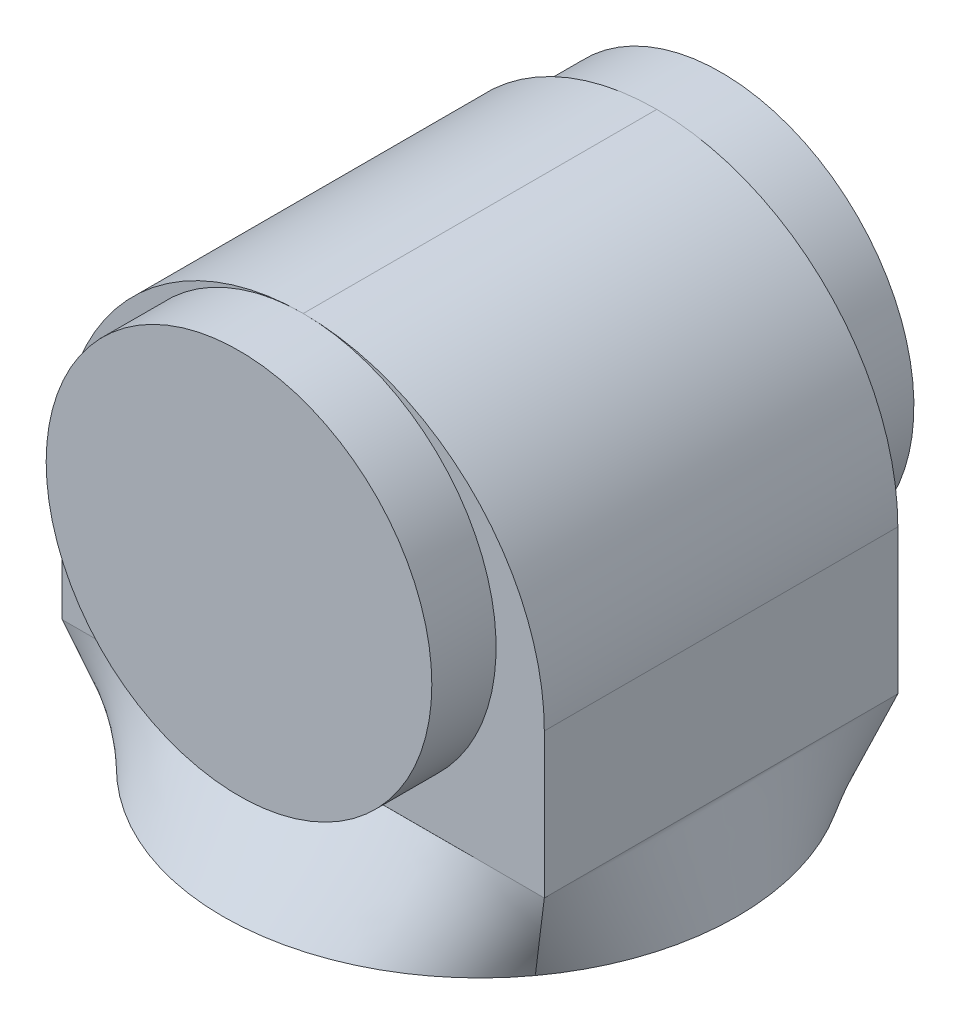
ISO-10303-21;
HEADER;
FILE_DESCRIPTION(('STEP AP214'),'2;1');
FILE_NAME('part.step','',(''),(''),'','','');
FILE_SCHEMA(('AUTOMOTIVE_DESIGN { 1 0 10303 214 1 1 1 1 }'));
ENDSEC;
DATA;
#1=APPLICATION_CONTEXT('core data for automotive mechanical design processes');
#2=APPLICATION_PROTOCOL_DEFINITION('international standard','automotive_design',2000,#1);
#3=PRODUCT_CONTEXT('',#1,'mechanical');
#4=PRODUCT('Part','Part','',(#3));
#5=PRODUCT_RELATED_PRODUCT_CATEGORY('part','',(#4));
#6=PRODUCT_DEFINITION_FORMATION('','',#4);
#7=PRODUCT_DEFINITION_CONTEXT('part definition',#1,'design');
#8=PRODUCT_DEFINITION('design','',#6,#7);
#9=PRODUCT_DEFINITION_SHAPE('','',#8);
#10=(LENGTH_UNIT() NAMED_UNIT(*) SI_UNIT(.MILLI.,.METRE.));
#11=(NAMED_UNIT(*) PLANE_ANGLE_UNIT() SI_UNIT($,.RADIAN.));
#12=(NAMED_UNIT(*) SI_UNIT($,.STERADIAN.) SOLID_ANGLE_UNIT());
#13=UNCERTAINTY_MEASURE_WITH_UNIT(LENGTH_MEASURE(1.E-05),#10,'distance_accuracy_value','');
#14=(GEOMETRIC_REPRESENTATION_CONTEXT(3) GLOBAL_UNCERTAINTY_ASSIGNED_CONTEXT((#13)) GLOBAL_UNIT_ASSIGNED_CONTEXT((#10,
#11,#12)) REPRESENTATION_CONTEXT('',''));
#15=CARTESIAN_POINT('',(0.,0.,0.));
#16=DIRECTION('',(0.,0.,1.));
#17=DIRECTION('',(1.,0.,0.));
#18=AXIS2_PLACEMENT_3D('',#15,#16,#17);
#19=CARTESIAN_POINT('',(75.,150.,-55.));
#20=DIRECTION('',(0.,0.,1.));
#21=DIRECTION('',(1.,0.,0.));
#22=AXIS2_PLACEMENT_3D('',#19,#20,#21);
#23=PLANE('',#22);
#24=DIRECTION('',(0.,-1.,0.));
#25=VECTOR('',#24,1.);
#26=CARTESIAN_POINT('',(-75.,150.,-55.));
#27=LINE('',#26,#25);
#28=CARTESIAN_POINT('',(-75.,75.,-55.));
#29=VERTEX_POINT('',#28);
#30=CARTESIAN_POINT('',(-75.,30.,-55.));
#31=VERTEX_POINT('',#30);
#32=EDGE_CURVE('E315',#29,#31,#27,.T.);
#33=ORIENTED_EDGE('',*,*,#32,.F.);
#34=CARTESIAN_POINT('',(0.,75.,-55.));
#35=DIRECTION('',(0.,0.,1.));
#36=DIRECTION('',(1.,0.,0.));
#37=AXIS2_PLACEMENT_3D('',#34,#35,#36);
#38=CIRCLE('',#37,75.);
#39=CARTESIAN_POINT('',(0.,150.,-55.));
#40=VERTEX_POINT('',#39);
#41=EDGE_CURVE('E12',#29,#40,#38,.F.);
#42=ORIENTED_EDGE('',*,*,#41,.T.);
#43=CARTESIAN_POINT('',(0.,90.,-55.));
#44=DIRECTION('',(0.,0.,-1.));
#45=DIRECTION('',(-1.,0.,0.));
#46=AXIS2_PLACEMENT_3D('',#43,#44,#45);
#47=CIRCLE('',#46,60.);
#48=CARTESIAN_POINT('',(0.,30.,-55.));
#49=VERTEX_POINT('',#48);
#50=EDGE_CURVE('E169',#49,#40,#47,.T.);
#51=ORIENTED_EDGE('',*,*,#50,.F.);
#52=DIRECTION('',(-1.,0.,0.));
#53=VECTOR('',#52,1.);
#54=CARTESIAN_POINT('',(-75.,30.,-55.));
#55=LINE('',#54,#53);
#56=EDGE_CURVE('E152',#49,#31,#55,.T.);
#57=ORIENTED_EDGE('',*,*,#56,.T.);
#58=EDGE_LOOP('',(#33,#42,#51,#57));
#59=FACE_BOUND('',#58,.T.);
#60=ADVANCED_FACE('F73',(#59),#23,.F.);
#61=CARTESIAN_POINT('',(-75.,150.,55.));
#62=DIRECTION('',(0.,0.,-1.));
#63=DIRECTION('',(-1.,0.,0.));
#64=AXIS2_PLACEMENT_3D('',#61,#62,#63);
#65=PLANE('',#64);
#66=DIRECTION('',(0.,-1.,0.));
#67=VECTOR('',#66,1.);
#68=CARTESIAN_POINT('',(75.,150.,55.));
#69=LINE('',#68,#67);
#70=CARTESIAN_POINT('',(75.,75.,55.));
#71=VERTEX_POINT('',#70);
#72=CARTESIAN_POINT('',(75.,30.,55.));
#73=VERTEX_POINT('',#72);
#74=EDGE_CURVE('E314',#71,#73,#69,.T.);
#75=ORIENTED_EDGE('',*,*,#74,.F.);
#76=CARTESIAN_POINT('',(0.,75.,55.));
#77=DIRECTION('',(0.,0.,-1.));
#78=DIRECTION('',(-1.,0.,0.));
#79=AXIS2_PLACEMENT_3D('',#76,#77,#78);
#80=CIRCLE('',#79,75.);
#81=CARTESIAN_POINT('',(0.,150.,55.));
#82=VERTEX_POINT('',#81);
#83=EDGE_CURVE('E321',#71,#82,#80,.F.);
#84=ORIENTED_EDGE('',*,*,#83,.T.);
#85=CARTESIAN_POINT('',(0.,90.,55.));
#86=DIRECTION('',(0.,0.,-1.));
#87=DIRECTION('',(-1.,0.,0.));
#88=AXIS2_PLACEMENT_3D('',#85,#86,#87);
#89=CIRCLE('',#88,60.);
#90=CARTESIAN_POINT('',(0.,30.,55.));
#91=VERTEX_POINT('',#90);
#92=EDGE_CURVE('E188',#82,#91,#89,.T.);
#93=ORIENTED_EDGE('',*,*,#92,.T.);
#94=DIRECTION('',(1.,0.,0.));
#95=VECTOR('',#94,1.);
#96=CARTESIAN_POINT('',(-75.,30.,55.));
#97=LINE('',#96,#95);
#98=EDGE_CURVE('E264',#91,#73,#97,.T.);
#99=ORIENTED_EDGE('',*,*,#98,.T.);
#100=EDGE_LOOP('',(#75,#84,#93,#99));
#101=FACE_BOUND('',#100,.T.);
#102=ADVANCED_FACE('F235',(#101),#65,.F.);
#103=CARTESIAN_POINT('',(0.,0.,0.));
#104=DIRECTION('',(0.,1.,0.));
#105=DIRECTION('',(0.,0.,1.));
#106=AXIS2_PLACEMENT_3D('',#103,#104,#105);
#107=PLANE('',#106);
#108=CARTESIAN_POINT('',(0.,0.,0.));
#109=DIRECTION('',(0.,1.,0.));
#110=DIRECTION('',(0.,0.,1.));
#111=AXIS2_PLACEMENT_3D('',#108,#109,#110);
#112=CIRCLE('',#111,80.);
#113=CARTESIAN_POINT('',(64.5123996684564,0.,-47.3090930902014));
#114=VERTEX_POINT('',#113);
#115=CARTESIAN_POINT('',(-64.5123996684564,0.,-47.3090930902014));
#116=VERTEX_POINT('',#115);
#117=EDGE_CURVE('E201',#114,#116,#112,.T.);
#118=ORIENTED_EDGE('',*,*,#117,.F.);
#119=CARTESIAN_POINT('',(64.5123996684564,0.,47.3090930902014));
#120=VERTEX_POINT('',#119);
#121=EDGE_CURVE('E206',#120,#114,#112,.T.);
#122=ORIENTED_EDGE('',*,*,#121,.F.);
#123=CARTESIAN_POINT('',(-64.5123996684564,0.,47.3090930902014));
#124=VERTEX_POINT('',#123);
#125=EDGE_CURVE('E212',#124,#120,#112,.T.);
#126=ORIENTED_EDGE('',*,*,#125,.F.);
#127=EDGE_CURVE('E209',#116,#124,#112,.T.);
#128=ORIENTED_EDGE('',*,*,#127,.F.);
#129=EDGE_LOOP('',(#118,#122,#126,#128));
#130=FACE_BOUND('',#129,.T.);
#131=ADVANCED_FACE('F224',(#130),#107,.F.);
#132=CARTESIAN_POINT('',(-64.5123996684564,0.,47.3090930902014));
#133=CARTESIAN_POINT('',(-75.,30.,55.));
#134=CARTESIAN_POINT('',(-62.9228042927339,0.,49.4767231480049));
#135=CARTESIAN_POINT('',(-71.875,30.,55.));
#136=CARTESIAN_POINT('',(-61.1829629270077,0.,51.6199145049797));
#137=CARTESIAN_POINT('',(-68.75,30.,55.));
#138=CARTESIAN_POINT('',(-57.3919413115934,0.,55.8044406702159));
#139=CARTESIAN_POINT('',(-62.5,30.,55.));
#140=CARTESIAN_POINT('',(-55.3406598682228,0.,57.8456997476821));
#141=CARTESIAN_POINT('',(-59.375,30.,55.));
#142=CARTESIAN_POINT('',(-50.9271324223384,0.,61.766826024873));
#143=CARTESIAN_POINT('',(-53.125,30.,55.));
#144=CARTESIAN_POINT('',(-48.56480446036,0.,63.6465743766228));
#145=CARTESIAN_POINT('',(-50.,30.,55.));
#146=CARTESIAN_POINT('',(-43.5438050003437,0.,67.1815726836163));
#147=CARTESIAN_POINT('',(-43.7499999999999,30.,55.));
#148=CARTESIAN_POINT('',(-40.8850909364118,0.,68.8366659888759));
#149=CARTESIAN_POINT('',(-40.6249999999999,30.,55.));
#150=CARTESIAN_POINT('',(-35.3021344850188,0.,71.8598395916967));
#151=CARTESIAN_POINT('',(-34.3749999999999,30.,55.));
#152=CARTESIAN_POINT('',(-32.3779074078663,0.,73.2277412415278));
#153=CARTESIAN_POINT('',(-31.2499999999999,30.,55.));
#154=CARTESIAN_POINT('',(-26.3114105752315,0.,75.6197107174453));
#155=CARTESIAN_POINT('',(-24.9999999999999,30.,55.));
#156=CARTESIAN_POINT('',(-23.1692247351779,0.,76.6436034413743));
#157=CARTESIAN_POINT('',(-21.8749999999999,30.,55.));
#158=CARTESIAN_POINT('',(-16.7295090332918,0.,78.3018419375485));
#159=CARTESIAN_POINT('',(-15.6249999999999,30.,55.));
#160=CARTESIAN_POINT('',(-13.4321291819054,0.,78.9360468022824));
#161=CARTESIAN_POINT('',(-12.4999999999999,30.,55.));
#162=CARTESIAN_POINT('',(-6.7564034228849,0.,79.7851652371464));
#163=CARTESIAN_POINT('',(-6.24999999999993,30.,55.));
#164=CARTESIAN_POINT('',(-3.37825566121702,0.,80.));
#165=CARTESIAN_POINT('',(-3.12499999999994,30.,55.));
#166=CARTESIAN_POINT('',(3.37825566121701,0.,80.));
#167=CARTESIAN_POINT('',(3.12500000000006,30.,55.));
#168=CARTESIAN_POINT('',(6.75640342288487,0.,79.7851652371463));
#169=CARTESIAN_POINT('',(6.25000000000008,30.,55.));
#170=CARTESIAN_POINT('',(13.4321291819054,0.,78.9360468022824));
#171=CARTESIAN_POINT('',(12.5000000000001,30.,55.));
#172=CARTESIAN_POINT('',(16.7295090332918,0.,78.3018419375485));
#173=CARTESIAN_POINT('',(15.6250000000001,30.,55.));
#174=CARTESIAN_POINT('',(23.1692247351779,0.,76.6436034413743));
#175=CARTESIAN_POINT('',(21.8750000000001,30.,55.));
#176=CARTESIAN_POINT('',(26.3114105752315,0.,75.6197107174453));
#177=CARTESIAN_POINT('',(25.0000000000001,30.,55.));
#178=CARTESIAN_POINT('',(32.3779074078663,0.,73.2277412415279));
#179=CARTESIAN_POINT('',(31.2500000000001,30.,55.));
#180=CARTESIAN_POINT('',(35.3021344850188,0.,71.8598395916967));
#181=CARTESIAN_POINT('',(34.3750000000001,30.,55.));
#182=CARTESIAN_POINT('',(40.8850909364118,0.,68.836665988876));
#183=CARTESIAN_POINT('',(40.625,30.,55.));
#184=CARTESIAN_POINT('',(43.5438050003437,0.,67.1815726836163));
#185=CARTESIAN_POINT('',(43.75,30.,55.));
#186=CARTESIAN_POINT('',(48.56480446036,0.,63.6465743766228));
#187=CARTESIAN_POINT('',(50.,30.,55.));
#188=CARTESIAN_POINT('',(50.9271324223383,0.,61.766826024873));
#189=CARTESIAN_POINT('',(53.125,30.,55.));
#190=CARTESIAN_POINT('',(55.3406598682228,0.,57.8456997476821));
#191=CARTESIAN_POINT('',(59.375,30.,55.));
#192=CARTESIAN_POINT('',(57.3919413115933,0.,55.8044406702159));
#193=CARTESIAN_POINT('',(62.5,30.,55.));
#194=CARTESIAN_POINT('',(61.1829629270078,0.,51.6199145049797));
#195=CARTESIAN_POINT('',(68.75,30.,55.));
#196=CARTESIAN_POINT('',(62.9228042927339,0.,49.4767231480049));
#197=CARTESIAN_POINT('',(71.875,30.,55.));
#198=CARTESIAN_POINT('',(64.5123996684564,0.,47.3090930902014));
#199=CARTESIAN_POINT('',(75.,30.,55.));
#200=B_SPLINE_SURFACE_WITH_KNOTS('',3,1,((#132,#133),(#134,#135),(#136,#137),(#138,#139),(#140,
#141),(#142,#143),(#144,#145),(#146,#147),(#148,#149),(#150,#151),(#152,#153),(#154,#155),(#156,
#157),(#158,#159),(#160,#161),(#162,#163),(#164,#165),(#166,#167),(#168,#169),(#170,#171),(#172,
#173),(#174,#175),(#176,#177),(#178,#179),(#180,#181),(#182,#183),(#184,#185),(#186,#187),(#188,
#189),(#190,#191),(#192,#193),(#194,#195),(#196,#197),(#198,#199)),.UNSPECIFIED.,.F.,.F.,.F.,(4,
2,2,2,2,2,2,2,2,2,2,2,2,2,2,2,4),(2,2),(0.,0.0625000000000001,0.125,0.1875,0.25,0.3125,0.375,
0.4375,0.5,0.5625,0.625,0.6875,0.75,0.8125,0.875,0.9375,1.),(0.,1.),.UNSPECIFIED.);
#201=DIRECTION('',(0.320744248994435,0.917495629662011,0.235212449262587));
#202=VECTOR('',#201,1.);
#203=CARTESIAN_POINT('',(69.7561998342282,15.,51.1545465451007));
#204=LINE('',#203,#202);
#205=EDGE_CURVE('E356',#120,#73,#204,.T.);
#206=CARTESIAN_POINT('',(-75.,30.,55.));
#207=VERTEX_POINT('',#206);
#208=EDGE_CURVE('E267',#207,#91,#97,.T.);
#209=DIRECTION('',(0.320744248994436,-0.917495629662011,-0.235212449262587));
#210=VECTOR('',#209,1.);
#211=CARTESIAN_POINT('',(-69.7561998342282,15.,51.1545465451007));
#212=LINE('',#211,#210);
#213=EDGE_CURVE('E395',#207,#124,#212,.T.);
#214=ORIENTED_EDGE('',*,*,#125,.T.);
#215=ORIENTED_EDGE('',*,*,#205,.T.);
#216=ORIENTED_EDGE('',*,*,#98,.F.);
#217=ORIENTED_EDGE('',*,*,#208,.F.);
#218=ORIENTED_EDGE('',*,*,#213,.T.);
#219=EDGE_LOOP('',(#214,#215,#216,#217,#218));
#220=FACE_BOUND('',#219,.T.);
#221=ADVANCED_FACE('F234',(#220),#200,.T.);
#222=CARTESIAN_POINT('',(64.5123996684564,0.,47.3090930902014));
#223=CARTESIAN_POINT('',(75.,30.,55.));
#224=CARTESIAN_POINT('',(66.8438062195162,0.,44.1299023387563));
#225=CARTESIAN_POINT('',(75.,30.,50.4166666666667));
#226=CARTESIAN_POINT('',(68.9963535215708,0.,40.6995203181713));
#227=CARTESIAN_POINT('',(75.,30.,45.8333333333334));
#228=CARTESIAN_POINT('',(72.8095980372032,0.,33.40224823367));
#229=CARTESIAN_POINT('',(75.,30.,36.6666666666667));
#230=CARTESIAN_POINT('',(74.4696510215688,0.,29.5354437212888));
#231=CARTESIAN_POINT('',(75.,30.,32.0833333333334));
#232=CARTESIAN_POINT('',(77.1803548847179,0.,21.4770616928074));
#233=CARTESIAN_POINT('',(75.,30.,22.9166666666667));
#234=CARTESIAN_POINT('',(78.2304164443755,0.,17.2858886089422));
#235=CARTESIAN_POINT('',(75.,30.,18.3333333333334));
#236=CARTESIAN_POINT('',(79.6404165989634,0.,8.72949288359428));
#237=CARTESIAN_POINT('',(75.,30.,9.16666666666673));
#238=CARTESIAN_POINT('',(80.,0.,4.364939682107));
#239=CARTESIAN_POINT('',(75.,30.,4.5833333333334));
#240=CARTESIAN_POINT('',(80.,0.,-4.364939682107));
#241=CARTESIAN_POINT('',(75.,30.,-4.58333333333327));
#242=CARTESIAN_POINT('',(79.6404165989634,0.,-8.72949288359429));
#243=CARTESIAN_POINT('',(75.,30.,-9.16666666666661));
#244=CARTESIAN_POINT('',(78.2304164443755,0.,-17.2858886089422));
#245=CARTESIAN_POINT('',(75.,30.,-18.3333333333333));
#246=CARTESIAN_POINT('',(77.1803548847179,0.,-21.4770616928074));
#247=CARTESIAN_POINT('',(75.,30.,-22.9166666666666));
#248=CARTESIAN_POINT('',(74.4696510215688,0.,-29.5354437212888));
#249=CARTESIAN_POINT('',(75.,30.,-32.0833333333333));
#250=CARTESIAN_POINT('',(72.8095980372032,0.,-33.40224823367));
#251=CARTESIAN_POINT('',(75.,30.,-36.6666666666666));
#252=CARTESIAN_POINT('',(68.9963535215708,0.,-40.6995203181713));
#253=CARTESIAN_POINT('',(75.,30.,-45.8333333333333));
#254=CARTESIAN_POINT('',(66.8438062195162,0.,-44.1299023387563));
#255=CARTESIAN_POINT('',(75.,30.,-50.4166666666667));
#256=CARTESIAN_POINT('',(64.5123996684564,0.,-47.3090930902014));
#257=CARTESIAN_POINT('',(75.,30.,-55.));
#258=B_SPLINE_SURFACE_WITH_KNOTS('',3,1,((#222,#223),(#224,#225),(#226,#227),(#228,#229),(#230,
#231),(#232,#233),(#234,#235),(#236,#237),(#238,#239),(#240,#241),(#242,#243),(#244,#245),(#246,
#247),(#248,#249),(#250,#251),(#252,#253),(#254,#255),(#256,#257)),.UNSPECIFIED.,.F.,.F.,.F.,(4,
2,2,2,2,2,2,2,4),(2,2),(0.,0.125,0.25,0.375,0.5,0.625,0.75,0.875,1.),(0.,1.),.UNSPECIFIED.);
#259=DIRECTION('',(0.320744248994436,0.917495629662011,-0.235212449262586));
#260=VECTOR('',#259,1.);
#261=CARTESIAN_POINT('',(69.7561998342282,15.,-51.1545465451007));
#262=LINE('',#261,#260);
#263=CARTESIAN_POINT('',(75.,30.,-55.));
#264=VERTEX_POINT('',#263);
#265=EDGE_CURVE('E357',#114,#264,#262,.T.);
#266=DIRECTION('',(0.,0.,-1.));
#267=VECTOR('',#266,1.);
#268=CARTESIAN_POINT('',(75.,30.,55.));
#269=LINE('',#268,#267);
#270=EDGE_CURVE('E166',#73,#264,#269,.T.);
#271=ORIENTED_EDGE('',*,*,#121,.T.);
#272=ORIENTED_EDGE('',*,*,#265,.T.);
#273=ORIENTED_EDGE('',*,*,#270,.F.);
#274=ORIENTED_EDGE('',*,*,#205,.F.);
#275=EDGE_LOOP('',(#271,#272,#273,#274));
#276=FACE_BOUND('',#275,.T.);
#277=ADVANCED_FACE('F354',(#276),#258,.T.);
#278=CARTESIAN_POINT('',(-64.5123996684564,0.,-47.3090930902014));
#279=CARTESIAN_POINT('',(-75.,30.,-55.));
#280=CARTESIAN_POINT('',(-66.8438062195161,0.,-44.1299023387563));
#281=CARTESIAN_POINT('',(-75.,30.,-50.4166666666667));
#282=CARTESIAN_POINT('',(-68.9963535215708,0.,-40.6995203181713));
#283=CARTESIAN_POINT('',(-75.,30.,-45.8333333333333));
#284=CARTESIAN_POINT('',(-72.8095980372032,0.,-33.40224823367));
#285=CARTESIAN_POINT('',(-75.,30.,-36.6666666666667));
#286=CARTESIAN_POINT('',(-74.4696510215688,0.,-29.5354437212888));
#287=CARTESIAN_POINT('',(-75.,30.,-32.0833333333333));
#288=CARTESIAN_POINT('',(-77.1803548847179,0.,-21.4770616928074));
#289=CARTESIAN_POINT('',(-75.,30.,-22.9166666666667));
#290=CARTESIAN_POINT('',(-78.2304164443755,0.,-17.2858886089422));
#291=CARTESIAN_POINT('',(-75.,30.,-18.3333333333333));
#292=CARTESIAN_POINT('',(-79.6404165989634,0.,-8.7294928835943));
#293=CARTESIAN_POINT('',(-75.,30.,-9.16666666666665));
#294=CARTESIAN_POINT('',(-80.,0.,-4.36493968210701));
#295=CARTESIAN_POINT('',(-75.,30.,-4.58333333333331));
#296=CARTESIAN_POINT('',(-80.,0.,4.36493968210699));
#297=CARTESIAN_POINT('',(-75.,30.,4.58333333333335));
#298=CARTESIAN_POINT('',(-79.6404165989634,0.,8.72949288359427));
#299=CARTESIAN_POINT('',(-75.,30.,9.16666666666669));
#300=CARTESIAN_POINT('',(-78.2304164443755,0.,17.2858886089422));
#301=CARTESIAN_POINT('',(-75.,30.,18.3333333333334));
#302=CARTESIAN_POINT('',(-77.1803548847179,0.,21.4770616928074));
#303=CARTESIAN_POINT('',(-75.,30.,22.9166666666667));
#304=CARTESIAN_POINT('',(-74.4696510215688,0.,29.5354437212888));
#305=CARTESIAN_POINT('',(-75.,30.,32.0833333333333));
#306=CARTESIAN_POINT('',(-72.8095980372032,0.,33.40224823367));
#307=CARTESIAN_POINT('',(-75.,30.,36.6666666666667));
#308=CARTESIAN_POINT('',(-68.9963535215708,0.,40.6995203181713));
#309=CARTESIAN_POINT('',(-75.,30.,45.8333333333333));
#310=CARTESIAN_POINT('',(-66.8438062195162,0.,44.1299023387563));
#311=CARTESIAN_POINT('',(-75.,30.,50.4166666666667));
#312=CARTESIAN_POINT('',(-64.5123996684564,0.,47.3090930902014));
#313=CARTESIAN_POINT('',(-75.,30.,55.));
#314=B_SPLINE_SURFACE_WITH_KNOTS('',3,1,((#278,#279),(#280,#281),(#282,#283),(#284,#285),(#286,
#287),(#288,#289),(#290,#291),(#292,#293),(#294,#295),(#296,#297),(#298,#299),(#300,#301),(#302,
#303),(#304,#305),(#306,#307),(#308,#309),(#310,#311),(#312,#313)),.UNSPECIFIED.,.F.,.F.,.F.,(4,
2,2,2,2,2,2,2,4),(2,2),(0.,0.125,0.25,0.375,0.5,0.625,0.75,0.875,1.),(0.,1.),.UNSPECIFIED.);
#315=DIRECTION('',(0.,0.,1.));
#316=VECTOR('',#315,1.);
#317=CARTESIAN_POINT('',(-75.,30.,55.));
#318=LINE('',#317,#316);
#319=EDGE_CURVE('E151',#31,#207,#318,.T.);
#320=DIRECTION('',(-0.320744248994437,0.917495629662011,-0.235212449262586));
#321=VECTOR('',#320,1.);
#322=CARTESIAN_POINT('',(-69.7561998342282,15.,-51.1545465451007));
#323=LINE('',#322,#321);
#324=EDGE_CURVE('E162',#116,#31,#323,.T.);
#325=ORIENTED_EDGE('',*,*,#127,.T.);
#326=ORIENTED_EDGE('',*,*,#213,.F.);
#327=ORIENTED_EDGE('',*,*,#319,.F.);
#328=ORIENTED_EDGE('',*,*,#324,.F.);
#329=EDGE_LOOP('',(#325,#326,#327,#328));
#330=FACE_BOUND('',#329,.T.);
#331=ADVANCED_FACE('F374',(#330),#314,.T.);
#332=CARTESIAN_POINT('',(64.5123996684564,0.,-47.3090930902014));
#333=CARTESIAN_POINT('',(75.,30.,-55.));
#334=CARTESIAN_POINT('',(62.9228042927339,0.,-49.4767231480049));
#335=CARTESIAN_POINT('',(71.875,30.,-55.));
#336=CARTESIAN_POINT('',(61.1829629270077,0.,-51.6199145049797));
#337=CARTESIAN_POINT('',(68.75,30.,-55.));
#338=CARTESIAN_POINT('',(57.3919413115933,0.,-55.8044406702159));
#339=CARTESIAN_POINT('',(62.5,30.,-55.));
#340=CARTESIAN_POINT('',(55.3406598682228,0.,-57.8456997476821));
#341=CARTESIAN_POINT('',(59.375,30.,-55.));
#342=CARTESIAN_POINT('',(50.9271324223383,0.,-61.766826024873));
#343=CARTESIAN_POINT('',(53.125,30.,-55.));
#344=CARTESIAN_POINT('',(48.56480446036,0.,-63.6465743766228));
#345=CARTESIAN_POINT('',(50.,30.,-55.));
#346=CARTESIAN_POINT('',(43.5438050003437,0.,-67.1815726836163));
#347=CARTESIAN_POINT('',(43.75,30.,-55.));
#348=CARTESIAN_POINT('',(40.8850909364118,0.,-68.8366659888759));
#349=CARTESIAN_POINT('',(40.625,30.,-55.));
#350=CARTESIAN_POINT('',(35.3021344850188,0.,-71.8598395916967));
#351=CARTESIAN_POINT('',(34.375,30.,-55.));
#352=CARTESIAN_POINT('',(32.3779074078663,0.,-73.2277412415279));
#353=CARTESIAN_POINT('',(31.25,30.,-55.));
#354=CARTESIAN_POINT('',(26.3114105752315,0.,-75.6197107174453));
#355=CARTESIAN_POINT('',(25.,30.,-55.));
#356=CARTESIAN_POINT('',(23.1692247351779,0.,-76.6436034413743));
#357=CARTESIAN_POINT('',(21.875,30.,-55.));
#358=CARTESIAN_POINT('',(16.7295090332918,0.,-78.3018419375485));
#359=CARTESIAN_POINT('',(15.625,30.,-55.));
#360=CARTESIAN_POINT('',(13.4321291819054,0.,-78.9360468022824));
#361=CARTESIAN_POINT('',(12.5,30.,-55.));
#362=CARTESIAN_POINT('',(6.75640342288489,0.,-79.7851652371464));
#363=CARTESIAN_POINT('',(6.24999999999999,30.,-55.));
#364=CARTESIAN_POINT('',(3.37825566121702,0.,-80.));
#365=CARTESIAN_POINT('',(3.12499999999999,30.,-55.));
#366=CARTESIAN_POINT('',(-3.378255661217,0.,-80.));
#367=CARTESIAN_POINT('',(-3.12500000000001,30.,-55.));
#368=CARTESIAN_POINT('',(-6.75640342288488,0.,-79.7851652371463));
#369=CARTESIAN_POINT('',(-6.25000000000001,30.,-55.));
#370=CARTESIAN_POINT('',(-13.4321291819054,0.,-78.9360468022824));
#371=CARTESIAN_POINT('',(-12.5,30.,-55.));
#372=CARTESIAN_POINT('',(-16.7295090332918,0.,-78.3018419375485));
#373=CARTESIAN_POINT('',(-15.625,30.,-55.));
#374=CARTESIAN_POINT('',(-23.1692247351779,0.,-76.6436034413743));
#375=CARTESIAN_POINT('',(-21.875,30.,-55.));
#376=CARTESIAN_POINT('',(-26.3114105752315,0.,-75.6197107174453));
#377=CARTESIAN_POINT('',(-25.,30.,-55.));
#378=CARTESIAN_POINT('',(-32.3779074078663,0.,-73.2277412415279));
#379=CARTESIAN_POINT('',(-31.25,30.,-55.));
#380=CARTESIAN_POINT('',(-35.3021344850188,0.,-71.8598395916967));
#381=CARTESIAN_POINT('',(-34.375,30.,-55.));
#382=CARTESIAN_POINT('',(-40.8850909364118,0.,-68.8366659888759));
#383=CARTESIAN_POINT('',(-40.625,30.,-55.));
#384=CARTESIAN_POINT('',(-43.5438050003437,0.,-67.1815726836163));
#385=CARTESIAN_POINT('',(-43.75,30.,-55.));
#386=CARTESIAN_POINT('',(-48.56480446036,0.,-63.6465743766228));
#387=CARTESIAN_POINT('',(-50.,30.,-55.));
#388=CARTESIAN_POINT('',(-50.9271324223383,0.,-61.766826024873));
#389=CARTESIAN_POINT('',(-53.125,30.,-55.));
#390=CARTESIAN_POINT('',(-55.3406598682228,0.,-57.8456997476821));
#391=CARTESIAN_POINT('',(-59.375,30.,-55.));
#392=CARTESIAN_POINT('',(-57.3919413115933,0.,-55.8044406702159));
#393=CARTESIAN_POINT('',(-62.5,30.,-55.));
#394=CARTESIAN_POINT('',(-61.1829629270077,0.,-51.6199145049797));
#395=CARTESIAN_POINT('',(-68.75,30.,-55.));
#396=CARTESIAN_POINT('',(-62.9228042927339,0.,-49.4767231480049));
#397=CARTESIAN_POINT('',(-71.875,30.,-55.));
#398=CARTESIAN_POINT('',(-64.5123996684564,0.,-47.3090930902014));
#399=CARTESIAN_POINT('',(-75.,30.,-55.));
#400=B_SPLINE_SURFACE_WITH_KNOTS('',3,1,((#332,#333),(#334,#335),(#336,#337),(#338,#339),(#340,
#341),(#342,#343),(#344,#345),(#346,#347),(#348,#349),(#350,#351),(#352,#353),(#354,#355),(#356,
#357),(#358,#359),(#360,#361),(#362,#363),(#364,#365),(#366,#367),(#368,#369),(#370,#371),(#372,
#373),(#374,#375),(#376,#377),(#378,#379),(#380,#381),(#382,#383),(#384,#385),(#386,#387),(#388,
#389),(#390,#391),(#392,#393),(#394,#395),(#396,#397),(#398,#399)),.UNSPECIFIED.,.F.,.F.,.F.,(4,
2,2,2,2,2,2,2,2,2,2,2,2,2,2,2,4),(2,2),(0.,0.0625,0.125,0.1875,0.25,0.3125,0.375,0.4375,0.5,
0.5625,0.625,0.6875,0.75,0.8125,0.875,0.9375,1.),(0.,1.),.UNSPECIFIED.);
#401=EDGE_CURVE('E138',#264,#49,#55,.T.);
#402=ORIENTED_EDGE('',*,*,#117,.T.);
#403=ORIENTED_EDGE('',*,*,#324,.T.);
#404=ORIENTED_EDGE('',*,*,#56,.F.);
#405=ORIENTED_EDGE('',*,*,#401,.F.);
#406=ORIENTED_EDGE('',*,*,#265,.F.);
#407=EDGE_LOOP('',(#402,#403,#404,#405,#406));
#408=FACE_BOUND('',#407,.T.);
#409=ADVANCED_FACE('F161',(#408),#400,.T.);
#410=EDGE_CURVE('E178',#91,#82,#89,.T.);
#411=ORIENTED_EDGE('',*,*,#410,.T.);
#412=CARTESIAN_POINT('',(0.,75.,55.));
#413=DIRECTION('',(0.,0.,-1.));
#414=DIRECTION('',(-1.,0.,0.));
#415=AXIS2_PLACEMENT_3D('',#412,#413,#414);
#416=CIRCLE('',#415,75.);
#417=CARTESIAN_POINT('',(-75.,75.,55.));
#418=VERTEX_POINT('',#417);
#419=EDGE_CURVE('E96',#82,#418,#416,.F.);
#420=ORIENTED_EDGE('',*,*,#419,.T.);
#421=DIRECTION('',(0.,-1.,0.));
#422=VECTOR('',#421,1.);
#423=CARTESIAN_POINT('',(-75.,150.,55.));
#424=LINE('',#423,#422);
#425=EDGE_CURVE('E187',#418,#207,#424,.T.);
#426=ORIENTED_EDGE('',*,*,#425,.T.);
#427=ORIENTED_EDGE('',*,*,#208,.T.);
#428=EDGE_LOOP('',(#411,#420,#426,#427));
#429=FACE_BOUND('',#428,.T.);
#430=ADVANCED_FACE('F236',(#429),#65,.F.);
#431=CARTESIAN_POINT('',(75.,150.,55.));
#432=DIRECTION('',(-1.,0.,0.));
#433=DIRECTION('',(0.,0.,1.));
#434=AXIS2_PLACEMENT_3D('',#431,#432,#433);
#435=PLANE('',#434);
#436=DIRECTION('',(0.,-1.,0.));
#437=VECTOR('',#436,1.);
#438=CARTESIAN_POINT('',(75.,150.,-55.));
#439=LINE('',#438,#437);
#440=CARTESIAN_POINT('',(75.,75.,-55.));
#441=VERTEX_POINT('',#440);
#442=EDGE_CURVE('E146',#441,#264,#439,.T.);
#443=ORIENTED_EDGE('',*,*,#442,.F.);
#444=DIRECTION('',(0.,0.,-1.));
#445=VECTOR('',#444,1.);
#446=CARTESIAN_POINT('',(75.,75.,55.));
#447=LINE('',#446,#445);
#448=EDGE_CURVE('E317',#441,#71,#447,.F.);
#449=ORIENTED_EDGE('',*,*,#448,.T.);
#450=ORIENTED_EDGE('',*,*,#74,.T.);
#451=ORIENTED_EDGE('',*,*,#270,.T.);
#452=EDGE_LOOP('',(#443,#449,#450,#451));
#453=FACE_BOUND('',#452,.T.);
#454=ADVANCED_FACE('F286',(#453),#435,.F.);
#455=EDGE_CURVE('E143',#40,#49,#47,.T.);
#456=ORIENTED_EDGE('',*,*,#455,.F.);
#457=CARTESIAN_POINT('',(0.,75.,-55.));
#458=DIRECTION('',(0.,0.,1.));
#459=DIRECTION('',(1.,0.,0.));
#460=AXIS2_PLACEMENT_3D('',#457,#458,#459);
#461=CIRCLE('',#460,75.);
#462=EDGE_CURVE('E269',#40,#441,#461,.F.);
#463=ORIENTED_EDGE('',*,*,#462,.T.);
#464=ORIENTED_EDGE('',*,*,#442,.T.);
#465=ORIENTED_EDGE('',*,*,#401,.T.);
#466=EDGE_LOOP('',(#456,#463,#464,#465));
#467=FACE_BOUND('',#466,.T.);
#468=ADVANCED_FACE('F141',(#467),#23,.F.);
#469=CARTESIAN_POINT('',(-75.,150.,-55.));
#470=DIRECTION('',(1.,0.,0.));
#471=DIRECTION('',(0.,0.,-1.));
#472=AXIS2_PLACEMENT_3D('',#469,#470,#471);
#473=PLANE('',#472);
#474=ORIENTED_EDGE('',*,*,#425,.F.);
#475=DIRECTION('',(0.,0.,1.));
#476=VECTOR('',#475,1.);
#477=CARTESIAN_POINT('',(-75.,75.,-55.));
#478=LINE('',#477,#476);
#479=EDGE_CURVE('E82',#418,#29,#478,.F.);
#480=ORIENTED_EDGE('',*,*,#479,.T.);
#481=ORIENTED_EDGE('',*,*,#32,.T.);
#482=ORIENTED_EDGE('',*,*,#319,.T.);
#483=EDGE_LOOP('',(#474,#480,#481,#482));
#484=FACE_BOUND('',#483,.T.);
#485=ADVANCED_FACE('F285',(#484),#473,.F.);
#486=CARTESIAN_POINT('',(0.,90.,75.));
#487=DIRECTION('',(0.,0.,-1.));
#488=DIRECTION('',(-1.,0.,0.));
#489=AXIS2_PLACEMENT_3D('',#486,#487,#488);
#490=CYLINDRICAL_SURFACE('',#489,60.);
#491=CARTESIAN_POINT('',(0.,90.,75.));
#492=DIRECTION('',(0.,0.,-1.));
#493=DIRECTION('',(-1.,0.,0.));
#494=AXIS2_PLACEMENT_3D('',#491,#492,#493);
#495=CIRCLE('',#494,60.);
#496=CARTESIAN_POINT('',(-60.,90.,75.));
#497=VERTEX_POINT('',#496);
#498=EDGE_CURVE('E182',#497,#497,#495,.T.);
#499=ORIENTED_EDGE('',*,*,#498,.T.);
#500=EDGE_LOOP('',(#499));
#501=FACE_BOUND('',#500,.T.);
#502=ORIENTED_EDGE('',*,*,#92,.F.);
#503=ORIENTED_EDGE('',*,*,#410,.F.);
#504=EDGE_LOOP('',(#502,#503));
#505=FACE_BOUND('',#504,.T.);
#506=ADVANCED_FACE('F501',(#501,#505),#490,.T.);
#507=CARTESIAN_POINT('',(0.,90.,75.));
#508=DIRECTION('',(0.,0.,-1.));
#509=DIRECTION('',(-1.,0.,0.));
#510=AXIS2_PLACEMENT_3D('',#507,#508,#509);
#511=PLANE('',#510);
#512=ORIENTED_EDGE('',*,*,#498,.F.);
#513=EDGE_LOOP('',(#512));
#514=FACE_BOUND('',#513,.T.);
#515=ADVANCED_FACE('F509',(#514),#511,.F.);
#516=CARTESIAN_POINT('',(0.,90.,-75.));
#517=DIRECTION('',(0.,0.,1.));
#518=DIRECTION('',(1.,0.,0.));
#519=AXIS2_PLACEMENT_3D('',#516,#517,#518);
#520=CYLINDRICAL_SURFACE('',#519,60.);
#521=CARTESIAN_POINT('',(0.,90.,-75.));
#522=DIRECTION('',(0.,0.,-1.));
#523=DIRECTION('',(-1.,0.,0.));
#524=AXIS2_PLACEMENT_3D('',#521,#522,#523);
#525=CIRCLE('',#524,60.);
#526=CARTESIAN_POINT('',(-60.,90.,-75.));
#527=VERTEX_POINT('',#526);
#528=EDGE_CURVE('E175',#527,#527,#525,.T.);
#529=ORIENTED_EDGE('',*,*,#528,.F.);
#530=EDGE_LOOP('',(#529));
#531=FACE_BOUND('',#530,.T.);
#532=ORIENTED_EDGE('',*,*,#455,.T.);
#533=ORIENTED_EDGE('',*,*,#50,.T.);
#534=EDGE_LOOP('',(#532,#533));
#535=FACE_BOUND('',#534,.T.);
#536=ADVANCED_FACE('F174',(#531,#535),#520,.T.);
#537=CARTESIAN_POINT('',(0.,90.,-75.));
#538=DIRECTION('',(0.,0.,1.));
#539=DIRECTION('',(-1.,0.,0.));
#540=AXIS2_PLACEMENT_3D('',#537,#538,#539);
#541=PLANE('',#540);
#542=ORIENTED_EDGE('',*,*,#528,.T.);
#543=EDGE_LOOP('',(#542));
#544=FACE_BOUND('',#543,.T.);
#545=ADVANCED_FACE('F472',(#544),#541,.F.);
#546=CARTESIAN_POINT('',(0.,75.,0.));
#547=DIRECTION('',(0.,0.,-1.));
#548=DIRECTION('',(-1.,0.,0.));
#549=AXIS2_PLACEMENT_3D('',#546,#547,#548);
#550=CYLINDRICAL_SURFACE('',#549,75.);
#551=ORIENTED_EDGE('',*,*,#479,.F.);
#552=ORIENTED_EDGE('',*,*,#419,.F.);
#553=DIRECTION('',(0.,0.,1.));
#554=VECTOR('',#553,1.);
#555=CARTESIAN_POINT('',(0.,150.,55.));
#556=LINE('',#555,#554);
#557=EDGE_CURVE('E77',#40,#82,#556,.T.);
#558=ORIENTED_EDGE('',*,*,#557,.F.);
#559=ORIENTED_EDGE('',*,*,#41,.F.);
#560=EDGE_LOOP('',(#551,#552,#558,#559));
#561=FACE_BOUND('',#560,.T.);
#562=ADVANCED_FACE('F75',(#561),#550,.T.);
#563=CARTESIAN_POINT('',(0.,75.,0.));
#564=DIRECTION('',(0.,0.,1.));
#565=DIRECTION('',(1.,0.,0.));
#566=AXIS2_PLACEMENT_3D('',#563,#564,#565);
#567=CYLINDRICAL_SURFACE('',#566,75.);
#568=ORIENTED_EDGE('',*,*,#83,.F.);
#569=ORIENTED_EDGE('',*,*,#448,.F.);
#570=ORIENTED_EDGE('',*,*,#462,.F.);
#571=ORIENTED_EDGE('',*,*,#557,.T.);
#572=EDGE_LOOP('',(#568,#569,#570,#571));
#573=FACE_BOUND('',#572,.T.);
#574=ADVANCED_FACE('F347',(#573),#567,.T.);
#575=CLOSED_SHELL('',(#60,#102,#131,#221,#277,#331,#409,#430,#454,#468,#485,#506,#515,#536,#545,
#562,#574));
#576=MANIFOLD_SOLID_BREP('B2',#575);
#577=ADVANCED_BREP_SHAPE_REPRESENTATION('',(#18,#576),#14);
#578=SHAPE_DEFINITION_REPRESENTATION(#9,#577);
ENDSEC;
END-ISO-10303-21;
